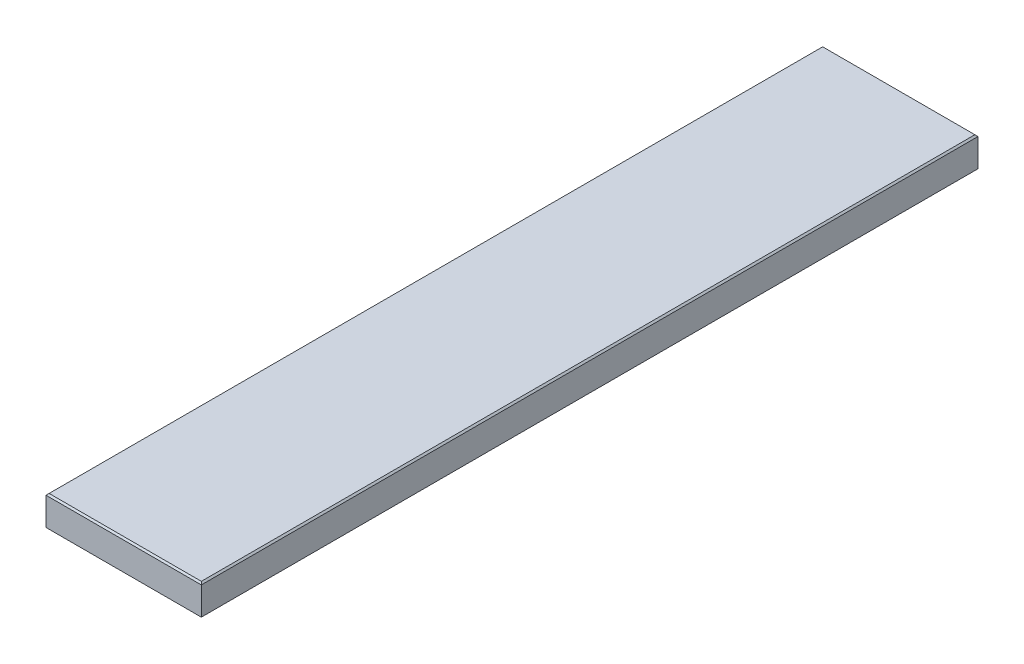
ISO-10303-21;
HEADER;
FILE_DESCRIPTION(('STEP AP214'),'2;1');
FILE_NAME('part.step','',(''),(''),'','','');
FILE_SCHEMA(('AUTOMOTIVE_DESIGN { 1 0 10303 214 1 1 1 1 }'));
ENDSEC;
DATA;
#1=APPLICATION_CONTEXT('core data for automotive mechanical design processes');
#2=APPLICATION_PROTOCOL_DEFINITION('international standard','automotive_design',2000,#1);
#3=PRODUCT_CONTEXT('',#1,'mechanical');
#4=PRODUCT('Part','Part','',(#3));
#5=PRODUCT_RELATED_PRODUCT_CATEGORY('part','',(#4));
#6=PRODUCT_DEFINITION_FORMATION('','',#4);
#7=PRODUCT_DEFINITION_CONTEXT('part definition',#1,'design');
#8=PRODUCT_DEFINITION('design','',#6,#7);
#9=PRODUCT_DEFINITION_SHAPE('','',#8);
#10=(LENGTH_UNIT() NAMED_UNIT(*) SI_UNIT(.MILLI.,.METRE.));
#11=(NAMED_UNIT(*) PLANE_ANGLE_UNIT() SI_UNIT($,.RADIAN.));
#12=(NAMED_UNIT(*) SI_UNIT($,.STERADIAN.) SOLID_ANGLE_UNIT());
#13=UNCERTAINTY_MEASURE_WITH_UNIT(LENGTH_MEASURE(1.E-05),#10,'distance_accuracy_value','');
#14=(GEOMETRIC_REPRESENTATION_CONTEXT(3) GLOBAL_UNCERTAINTY_ASSIGNED_CONTEXT((#13)) GLOBAL_UNIT_ASSIGNED_CONTEXT((#10,
#11,#12)) REPRESENTATION_CONTEXT('',''));
#15=CARTESIAN_POINT('',(0.,0.,0.));
#16=DIRECTION('',(0.,0.,1.));
#17=DIRECTION('',(1.,0.,0.));
#18=AXIS2_PLACEMENT_3D('',#15,#16,#17);
#19=CARTESIAN_POINT('',(0.,4.,0.));
#20=DIRECTION('',(1.,0.,0.));
#21=DIRECTION('',(0.,0.,-1.));
#22=AXIS2_PLACEMENT_3D('',#19,#20,#21);
#23=PLANE('',#22);
#24=DIRECTION('',(0.,-1.,0.));
#25=VECTOR('',#24,1.);
#26=CARTESIAN_POINT('',(0.,4.,-100.));
#27=LINE('',#26,#25);
#28=CARTESIAN_POINT('',(0.,3.79999999999999,-100.));
#29=VERTEX_POINT('',#28);
#30=CARTESIAN_POINT('',(0.,0.200000000000006,-100.));
#31=VERTEX_POINT('',#30);
#32=EDGE_CURVE('E147',#29,#31,#27,.T.);
#33=ORIENTED_EDGE('',*,*,#32,.T.);
#34=DIRECTION('',(0.,0.,1.));
#35=VECTOR('',#34,1.);
#36=CARTESIAN_POINT('',(0.,0.200000000000006,0.));
#37=LINE('',#36,#35);
#38=CARTESIAN_POINT('',(0.,0.200000000000006,0.));
#39=VERTEX_POINT('',#38);
#40=EDGE_CURVE('E156',#31,#39,#37,.T.);
#41=ORIENTED_EDGE('',*,*,#40,.T.);
#42=DIRECTION('',(0.,-1.,0.));
#43=VECTOR('',#42,1.);
#44=CARTESIAN_POINT('',(0.,4.,0.));
#45=LINE('',#44,#43);
#46=CARTESIAN_POINT('',(0.,3.79999999999999,0.));
#47=VERTEX_POINT('',#46);
#48=EDGE_CURVE('E125',#47,#39,#45,.T.);
#49=ORIENTED_EDGE('',*,*,#48,.F.);
#50=DIRECTION('',(0.,0.,-1.));
#51=VECTOR('',#50,1.);
#52=CARTESIAN_POINT('',(0.,3.79999999999999,0.));
#53=LINE('',#52,#51);
#54=EDGE_CURVE('E158',#47,#29,#53,.T.);
#55=ORIENTED_EDGE('',*,*,#54,.T.);
#56=EDGE_LOOP('',(#33,#41,#49,#55));
#57=FACE_BOUND('',#56,.T.);
#58=ADVANCED_FACE('F37',(#57),#23,.F.);
#59=CARTESIAN_POINT('',(0.,4.,0.));
#60=DIRECTION('',(0.,0.,-1.));
#61=DIRECTION('',(-1.,0.,0.));
#62=AXIS2_PLACEMENT_3D('',#59,#60,#61);
#63=PLANE('',#62);
#64=ORIENTED_EDGE('',*,*,#48,.T.);
#65=DIRECTION('',(1.,0.,0.));
#66=VECTOR('',#65,1.);
#67=CARTESIAN_POINT('',(20.,0.200000000000006,0.));
#68=LINE('',#67,#66);
#69=CARTESIAN_POINT('',(20.,0.200000000000006,0.));
#70=VERTEX_POINT('',#69);
#71=EDGE_CURVE('E124',#39,#70,#68,.T.);
#72=ORIENTED_EDGE('',*,*,#71,.T.);
#73=DIRECTION('',(0.,-1.,0.));
#74=VECTOR('',#73,1.);
#75=CARTESIAN_POINT('',(20.,4.,0.));
#76=LINE('',#75,#74);
#77=CARTESIAN_POINT('',(20.,3.79999999999999,0.));
#78=VERTEX_POINT('',#77);
#79=EDGE_CURVE('E107',#78,#70,#76,.T.);
#80=ORIENTED_EDGE('',*,*,#79,.F.);
#81=DIRECTION('',(-1.,0.,0.));
#82=VECTOR('',#81,1.);
#83=CARTESIAN_POINT('',(0.,3.79999999999999,0.));
#84=LINE('',#83,#82);
#85=EDGE_CURVE('E121',#78,#47,#84,.T.);
#86=ORIENTED_EDGE('',*,*,#85,.T.);
#87=EDGE_LOOP('',(#64,#72,#80,#86));
#88=FACE_BOUND('',#87,.T.);
#89=ADVANCED_FACE('F120',(#88),#63,.F.);
#90=CARTESIAN_POINT('',(20.,4.,0.));
#91=DIRECTION('',(-1.,0.,0.));
#92=DIRECTION('',(0.,0.,1.));
#93=AXIS2_PLACEMENT_3D('',#90,#91,#92);
#94=PLANE('',#93);
#95=ORIENTED_EDGE('',*,*,#79,.T.);
#96=DIRECTION('',(0.,0.,-1.));
#97=VECTOR('',#96,1.);
#98=CARTESIAN_POINT('',(20.,0.200000000000006,-100.));
#99=LINE('',#98,#97);
#100=CARTESIAN_POINT('',(20.,0.200000000000006,-100.));
#101=VERTEX_POINT('',#100);
#102=EDGE_CURVE('E113',#70,#101,#99,.T.);
#103=ORIENTED_EDGE('',*,*,#102,.T.);
#104=DIRECTION('',(0.,-1.,0.));
#105=VECTOR('',#104,1.);
#106=CARTESIAN_POINT('',(20.,4.,-100.));
#107=LINE('',#106,#105);
#108=CARTESIAN_POINT('',(20.,3.79999999999999,-100.));
#109=VERTEX_POINT('',#108);
#110=EDGE_CURVE('E109',#109,#101,#107,.T.);
#111=ORIENTED_EDGE('',*,*,#110,.F.);
#112=DIRECTION('',(0.,0.,1.));
#113=VECTOR('',#112,1.);
#114=CARTESIAN_POINT('',(20.,3.79999999999999,0.));
#115=LINE('',#114,#113);
#116=EDGE_CURVE('E104',#109,#78,#115,.T.);
#117=ORIENTED_EDGE('',*,*,#116,.T.);
#118=EDGE_LOOP('',(#95,#103,#111,#117));
#119=FACE_BOUND('',#118,.T.);
#120=ADVANCED_FACE('F106',(#119),#94,.F.);
#121=CARTESIAN_POINT('',(0.,4.,-100.));
#122=DIRECTION('',(0.,0.,1.));
#123=DIRECTION('',(1.,0.,0.));
#124=AXIS2_PLACEMENT_3D('',#121,#122,#123);
#125=PLANE('',#124);
#126=ORIENTED_EDGE('',*,*,#110,.T.);
#127=DIRECTION('',(-1.,0.,0.));
#128=VECTOR('',#127,1.);
#129=CARTESIAN_POINT('',(0.,0.200000000000006,-100.));
#130=LINE('',#129,#128);
#131=EDGE_CURVE('E160',#101,#31,#130,.T.);
#132=ORIENTED_EDGE('',*,*,#131,.T.);
#133=ORIENTED_EDGE('',*,*,#32,.F.);
#134=DIRECTION('',(1.,0.,0.));
#135=VECTOR('',#134,1.);
#136=CARTESIAN_POINT('',(0.,3.79999999999999,-100.));
#137=LINE('',#136,#135);
#138=EDGE_CURVE('E162',#29,#109,#137,.T.);
#139=ORIENTED_EDGE('',*,*,#138,.T.);
#140=EDGE_LOOP('',(#126,#132,#133,#139));
#141=FACE_BOUND('',#140,.T.);
#142=ADVANCED_FACE('F200',(#141),#125,.F.);
#143=CARTESIAN_POINT('',(0.,4.,0.));
#144=DIRECTION('',(0.,-1.,0.));
#145=DIRECTION('',(0.,0.,-1.));
#146=AXIS2_PLACEMENT_3D('',#143,#144,#145);
#147=PLANE('',#146);
#148=DIRECTION('',(0.,0.,-1.));
#149=VECTOR('',#148,1.);
#150=CARTESIAN_POINT('',(19.8,4.,0.));
#151=LINE('',#150,#149);
#152=CARTESIAN_POINT('',(19.8,4.,-0.200000000000006));
#153=VERTEX_POINT('',#152);
#154=CARTESIAN_POINT('',(19.8,4.,-99.8));
#155=VERTEX_POINT('',#154);
#156=EDGE_CURVE('E47',#153,#155,#151,.T.);
#157=ORIENTED_EDGE('',*,*,#156,.T.);
#158=DIRECTION('',(-1.,0.,0.));
#159=VECTOR('',#158,1.);
#160=CARTESIAN_POINT('',(0.,4.,-99.8));
#161=LINE('',#160,#159);
#162=CARTESIAN_POINT('',(0.199999999999988,4.,-99.8));
#163=VERTEX_POINT('',#162);
#164=EDGE_CURVE('E11',#155,#163,#161,.T.);
#165=ORIENTED_EDGE('',*,*,#164,.T.);
#166=DIRECTION('',(0.,0.,1.));
#167=VECTOR('',#166,1.);
#168=CARTESIAN_POINT('',(0.200000000000006,4.,0.));
#169=LINE('',#168,#167);
#170=CARTESIAN_POINT('',(0.200000000000006,4.,-0.200000000000006));
#171=VERTEX_POINT('',#170);
#172=EDGE_CURVE('E154',#163,#171,#169,.T.);
#173=ORIENTED_EDGE('',*,*,#172,.T.);
#174=DIRECTION('',(1.,0.,0.));
#175=VECTOR('',#174,1.);
#176=CARTESIAN_POINT('',(0.,4.,-0.200000000000006));
#177=LINE('',#176,#175);
#178=EDGE_CURVE('E58',#171,#153,#177,.T.);
#179=ORIENTED_EDGE('',*,*,#178,.T.);
#180=EDGE_LOOP('',(#157,#165,#173,#179));
#181=FACE_BOUND('',#180,.T.);
#182=ADVANCED_FACE('F206',(#181),#147,.F.);
#183=CARTESIAN_POINT('',(0.,0.,0.));
#184=DIRECTION('',(0.,-1.,0.));
#185=DIRECTION('',(0.,0.,-1.));
#186=AXIS2_PLACEMENT_3D('',#183,#184,#185);
#187=PLANE('',#186);
#188=DIRECTION('',(0.,0.,1.));
#189=VECTOR('',#188,1.);
#190=CARTESIAN_POINT('',(19.8,0.,0.));
#191=LINE('',#190,#189);
#192=CARTESIAN_POINT('',(19.8,0.,-99.8));
#193=VERTEX_POINT('',#192);
#194=CARTESIAN_POINT('',(19.8,0.,-0.200000000000006));
#195=VERTEX_POINT('',#194);
#196=EDGE_CURVE('E167',#193,#195,#191,.T.);
#197=ORIENTED_EDGE('',*,*,#196,.T.);
#198=DIRECTION('',(-1.,0.,0.));
#199=VECTOR('',#198,1.);
#200=CARTESIAN_POINT('',(0.,0.,-0.200000000000006));
#201=LINE('',#200,#199);
#202=CARTESIAN_POINT('',(0.200000000000006,0.,-0.200000000000006));
#203=VERTEX_POINT('',#202);
#204=EDGE_CURVE('E114',#195,#203,#201,.T.);
#205=ORIENTED_EDGE('',*,*,#204,.T.);
#206=DIRECTION('',(0.,0.,-1.));
#207=VECTOR('',#206,1.);
#208=CARTESIAN_POINT('',(0.199999999999988,0.,-100.));
#209=LINE('',#208,#207);
#210=CARTESIAN_POINT('',(0.199999999999988,0.,-99.8));
#211=VERTEX_POINT('',#210);
#212=EDGE_CURVE('E171',#203,#211,#209,.T.);
#213=ORIENTED_EDGE('',*,*,#212,.T.);
#214=DIRECTION('',(1.,0.,0.));
#215=VECTOR('',#214,1.);
#216=CARTESIAN_POINT('',(20.,0.,-99.8));
#217=LINE('',#216,#215);
#218=EDGE_CURVE('E169',#211,#193,#217,.T.);
#219=ORIENTED_EDGE('',*,*,#218,.T.);
#220=EDGE_LOOP('',(#197,#205,#213,#219));
#221=FACE_BOUND('',#220,.T.);
#222=ADVANCED_FACE('F208',(#221),#187,.T.);
#223=CARTESIAN_POINT('',(0.,0.200000000000006,-100.));
#224=DIRECTION('',(0.,-0.707106781186548,-0.707106781186548));
#225=DIRECTION('',(1.,0.,0.));
#226=AXIS2_PLACEMENT_3D('',#223,#224,#225);
#227=PLANE('',#226);
#228=DIRECTION('',(-0.577350269189632,-0.577350269189622,0.577350269189622));
#229=VECTOR('',#228,1.);
#230=CARTESIAN_POINT('',(13.3333333333332,-6.4666666666667,-93.3333333333333));
#231=LINE('',#230,#229);
#232=EDGE_CURVE('E148',#193,#101,#231,.F.);
#233=ORIENTED_EDGE('',*,*,#232,.F.);
#234=ORIENTED_EDGE('',*,*,#218,.F.);
#235=DIRECTION('',(0.577350269189626,-0.577350269189626,0.577350269189626));
#236=VECTOR('',#235,1.);
#237=CARTESIAN_POINT('',(33.3333333333333,-33.1333333333333,-66.6666666666667));
#238=LINE('',#237,#236);
#239=EDGE_CURVE('E144',#31,#211,#238,.T.);
#240=ORIENTED_EDGE('',*,*,#239,.F.);
#241=ORIENTED_EDGE('',*,*,#131,.F.);
#242=EDGE_LOOP('',(#233,#234,#240,#241));
#243=FACE_BOUND('',#242,.T.);
#244=ADVANCED_FACE('F187',(#243),#227,.T.);
#245=CARTESIAN_POINT('',(0.,0.200000000000006,0.));
#246=DIRECTION('',(-0.707106781186548,-0.707106781186548,0.));
#247=DIRECTION('',(0.,0.,-1.));
#248=AXIS2_PLACEMENT_3D('',#245,#246,#247);
#249=PLANE('',#248);
#250=ORIENTED_EDGE('',*,*,#239,.T.);
#251=ORIENTED_EDGE('',*,*,#212,.F.);
#252=DIRECTION('',(-0.577350269189626,0.577350269189626,0.577350269189626));
#253=VECTOR('',#252,1.);
#254=CARTESIAN_POINT('',(0.,0.200000000000006,0.));
#255=LINE('',#254,#253);
#256=EDGE_CURVE('E135',#39,#203,#255,.F.);
#257=ORIENTED_EDGE('',*,*,#256,.F.);
#258=ORIENTED_EDGE('',*,*,#40,.F.);
#259=EDGE_LOOP('',(#250,#251,#257,#258));
#260=FACE_BOUND('',#259,.T.);
#261=ADVANCED_FACE('F191',(#260),#249,.T.);
#262=CARTESIAN_POINT('',(20.,0.200000000000006,0.));
#263=DIRECTION('',(0.707106781186541,-0.707106781186554,0.));
#264=DIRECTION('',(0.,0.,1.));
#265=AXIS2_PLACEMENT_3D('',#262,#263,#264);
#266=PLANE('',#265);
#267=ORIENTED_EDGE('',*,*,#232,.T.);
#268=ORIENTED_EDGE('',*,*,#102,.F.);
#269=DIRECTION('',(-0.577350269189633,-0.577350269189622,-0.577350269189622));
#270=VECTOR('',#269,1.);
#271=CARTESIAN_POINT('',(20.,0.200000000000006,0.));
#272=LINE('',#271,#270);
#273=EDGE_CURVE('E134',#195,#70,#272,.F.);
#274=ORIENTED_EDGE('',*,*,#273,.F.);
#275=ORIENTED_EDGE('',*,*,#196,.F.);
#276=EDGE_LOOP('',(#267,#268,#274,#275));
#277=FACE_BOUND('',#276,.T.);
#278=ADVANCED_FACE('F199',(#277),#266,.T.);
#279=CARTESIAN_POINT('',(0.,0.200000000000006,0.));
#280=DIRECTION('',(0.,-0.707106781186548,0.707106781186548));
#281=DIRECTION('',(-1.,0.,0.));
#282=AXIS2_PLACEMENT_3D('',#279,#280,#281);
#283=PLANE('',#282);
#284=ORIENTED_EDGE('',*,*,#256,.T.);
#285=ORIENTED_EDGE('',*,*,#204,.F.);
#286=ORIENTED_EDGE('',*,*,#273,.T.);
#287=ORIENTED_EDGE('',*,*,#71,.F.);
#288=EDGE_LOOP('',(#284,#285,#286,#287));
#289=FACE_BOUND('',#288,.T.);
#290=ADVANCED_FACE('F194',(#289),#283,.T.);
#291=CARTESIAN_POINT('',(0.,4.,-0.200000000000006));
#292=DIRECTION('',(0.,-0.707106781186548,-0.707106781186548));
#293=DIRECTION('',(1.,0.,0.));
#294=AXIS2_PLACEMENT_3D('',#291,#292,#293);
#295=PLANE('',#294);
#296=DIRECTION('',(0.577350269189626,0.577350269189626,-0.577350269189626));
#297=VECTOR('',#296,1.);
#298=CARTESIAN_POINT('',(0.133333333333337,3.93333333333333,-0.133333333333337));
#299=LINE('',#298,#297);
#300=EDGE_CURVE('E130',#47,#171,#299,.T.);
#301=ORIENTED_EDGE('',*,*,#300,.F.);
#302=ORIENTED_EDGE('',*,*,#85,.F.);
#303=DIRECTION('',(-0.577350269189633,0.577350269189622,-0.577350269189622));
#304=VECTOR('',#303,1.);
#305=CARTESIAN_POINT('',(13.1999999999998,10.6,-6.80000000000004));
#306=LINE('',#305,#304);
#307=EDGE_CURVE('E42',#153,#78,#306,.F.);
#308=ORIENTED_EDGE('',*,*,#307,.F.);
#309=ORIENTED_EDGE('',*,*,#178,.F.);
#310=EDGE_LOOP('',(#301,#302,#308,#309));
#311=FACE_BOUND('',#310,.T.);
#312=ADVANCED_FACE('F40',(#311),#295,.F.);
#313=CARTESIAN_POINT('',(19.8,4.,0.));
#314=DIRECTION('',(-0.707106781186541,-0.707106781186554,0.));
#315=DIRECTION('',(0.,0.,-1.));
#316=AXIS2_PLACEMENT_3D('',#313,#314,#315);
#317=PLANE('',#316);
#318=ORIENTED_EDGE('',*,*,#307,.T.);
#319=ORIENTED_EDGE('',*,*,#116,.F.);
#320=DIRECTION('',(-0.577350269189632,0.577350269189622,0.577350269189622));
#321=VECTOR('',#320,1.);
#322=CARTESIAN_POINT('',(-13.4666666666669,37.2666666666663,-66.5333333333337));
#323=LINE('',#322,#321);
#324=EDGE_CURVE('E137',#155,#109,#323,.F.);
#325=ORIENTED_EDGE('',*,*,#324,.F.);
#326=ORIENTED_EDGE('',*,*,#156,.F.);
#327=EDGE_LOOP('',(#318,#319,#325,#326));
#328=FACE_BOUND('',#327,.T.);
#329=ADVANCED_FACE('F133',(#328),#317,.F.);
#330=CARTESIAN_POINT('',(0.200000000000006,4.,0.));
#331=DIRECTION('',(0.707106781186548,-0.707106781186548,0.));
#332=DIRECTION('',(0.,0.,1.));
#333=AXIS2_PLACEMENT_3D('',#330,#331,#332);
#334=PLANE('',#333);
#335=ORIENTED_EDGE('',*,*,#300,.T.);
#336=ORIENTED_EDGE('',*,*,#172,.F.);
#337=DIRECTION('',(-0.577350269189626,-0.577350269189626,-0.577350269189626));
#338=VECTOR('',#337,1.);
#339=CARTESIAN_POINT('',(33.4666666666667,37.2666666666667,-66.5333333333333));
#340=LINE('',#339,#338);
#341=EDGE_CURVE('E140',#29,#163,#340,.F.);
#342=ORIENTED_EDGE('',*,*,#341,.F.);
#343=ORIENTED_EDGE('',*,*,#54,.F.);
#344=EDGE_LOOP('',(#335,#336,#342,#343));
#345=FACE_BOUND('',#344,.T.);
#346=ADVANCED_FACE('F205',(#345),#334,.F.);
#347=CARTESIAN_POINT('',(0.,4.,-99.8));
#348=DIRECTION('',(0.,-0.707106781186548,0.707106781186548));
#349=DIRECTION('',(-1.,0.,0.));
#350=AXIS2_PLACEMENT_3D('',#347,#348,#349);
#351=PLANE('',#350);
#352=ORIENTED_EDGE('',*,*,#324,.T.);
#353=ORIENTED_EDGE('',*,*,#138,.F.);
#354=ORIENTED_EDGE('',*,*,#341,.T.);
#355=ORIENTED_EDGE('',*,*,#164,.F.);
#356=EDGE_LOOP('',(#352,#353,#354,#355));
#357=FACE_BOUND('',#356,.T.);
#358=ADVANCED_FACE('F203',(#357),#351,.F.);
#359=CLOSED_SHELL('',(#58,#89,#120,#142,#182,#222,#244,#261,#278,#290,#312,#329,#346,#358));
#360=MANIFOLD_SOLID_BREP('B2',#359);
#361=ADVANCED_BREP_SHAPE_REPRESENTATION('',(#18,#360),#14);
#362=SHAPE_DEFINITION_REPRESENTATION(#9,#361);
ENDSEC;
END-ISO-10303-21;
